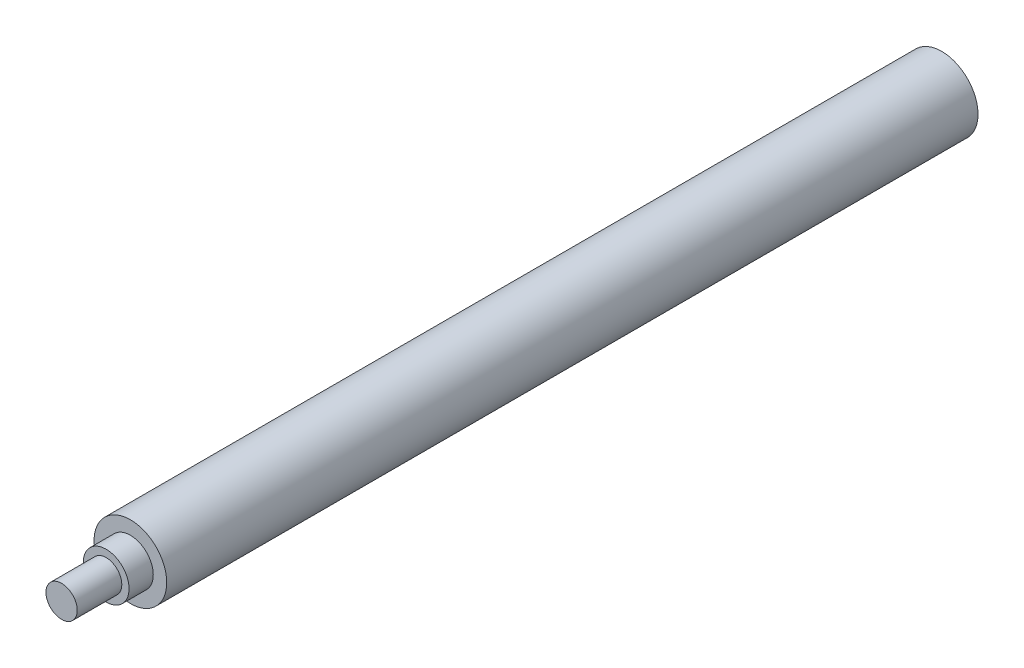
ISO-10303-21;
HEADER;
FILE_DESCRIPTION(('STEP AP214'),'2;1');
FILE_NAME('part.step','',(''),(''),'','','');
FILE_SCHEMA(('AUTOMOTIVE_DESIGN { 1 0 10303 214 1 1 1 1 }'));
ENDSEC;
DATA;
#1=APPLICATION_CONTEXT('core data for automotive mechanical design processes');
#2=APPLICATION_PROTOCOL_DEFINITION('international standard','automotive_design',2000,#1);
#3=PRODUCT_CONTEXT('',#1,'mechanical');
#4=PRODUCT('Part','Part','',(#3));
#5=PRODUCT_RELATED_PRODUCT_CATEGORY('part','',(#4));
#6=PRODUCT_DEFINITION_FORMATION('','',#4);
#7=PRODUCT_DEFINITION_CONTEXT('part definition',#1,'design');
#8=PRODUCT_DEFINITION('design','',#6,#7);
#9=PRODUCT_DEFINITION_SHAPE('','',#8);
#10=(LENGTH_UNIT() NAMED_UNIT(*) SI_UNIT(.MILLI.,.METRE.));
#11=(NAMED_UNIT(*) PLANE_ANGLE_UNIT() SI_UNIT($,.RADIAN.));
#12=(NAMED_UNIT(*) SI_UNIT($,.STERADIAN.) SOLID_ANGLE_UNIT());
#13=UNCERTAINTY_MEASURE_WITH_UNIT(LENGTH_MEASURE(1.E-05),#10,'distance_accuracy_value','');
#14=(GEOMETRIC_REPRESENTATION_CONTEXT(3) GLOBAL_UNCERTAINTY_ASSIGNED_CONTEXT((#13)) GLOBAL_UNIT_ASSIGNED_CONTEXT((#10,
#11,#12)) REPRESENTATION_CONTEXT('',''));
#15=CARTESIAN_POINT('',(0.,0.,0.));
#16=DIRECTION('',(0.,0.,1.));
#17=DIRECTION('',(1.,0.,0.));
#18=AXIS2_PLACEMENT_3D('',#15,#16,#17);
#19=CARTESIAN_POINT('',(0.,0.,10.6045000000001));
#20=DIRECTION('',(0.,0.,1.));
#21=DIRECTION('',(1.,0.,0.));
#22=AXIS2_PLACEMENT_3D('',#19,#20,#21);
#23=CYLINDRICAL_SURFACE('',#22,4.7625);
#24=CARTESIAN_POINT('',(0.,0.,-104.775));
#25=DIRECTION('',(0.,0.,1.));
#26=DIRECTION('',(1.,0.,0.));
#27=AXIS2_PLACEMENT_3D('',#24,#25,#26);
#28=CIRCLE('',#27,4.7625);
#29=CARTESIAN_POINT('',(4.7625,0.,-104.775));
#30=VERTEX_POINT('',#29);
#31=EDGE_CURVE('E12',#30,#30,#28,.T.);
#32=ORIENTED_EDGE('',*,*,#31,.T.);
#33=EDGE_LOOP('',(#32));
#34=FACE_BOUND('',#33,.T.);
#35=CARTESIAN_POINT('',(0.,0.,1.5875));
#36=DIRECTION('',(0.,0.,1.));
#37=DIRECTION('',(1.,0.,0.));
#38=AXIS2_PLACEMENT_3D('',#35,#36,#37);
#39=CIRCLE('',#38,4.7625);
#40=CARTESIAN_POINT('',(4.7625,0.,1.5875));
#41=VERTEX_POINT('',#40);
#42=EDGE_CURVE('E63',#41,#41,#39,.T.);
#43=ORIENTED_EDGE('',*,*,#42,.F.);
#44=EDGE_LOOP('',(#43));
#45=FACE_BOUND('',#44,.T.);
#46=ADVANCED_FACE('F41',(#34,#45),#23,.T.);
#47=CARTESIAN_POINT('',(4.7625,0.,-104.775));
#48=DIRECTION('',(0.,0.,-1.));
#49=DIRECTION('',(-1.,0.,0.));
#50=AXIS2_PLACEMENT_3D('',#47,#48,#49);
#51=PLANE('',#50);
#52=ORIENTED_EDGE('',*,*,#31,.F.);
#53=EDGE_LOOP('',(#52));
#54=FACE_BOUND('',#53,.T.);
#55=ADVANCED_FACE('F71',(#54),#51,.T.);
#56=CARTESIAN_POINT('',(2.05,0.,10.6045000000001));
#57=DIRECTION('',(0.,0.,1.));
#58=DIRECTION('',(1.,0.,0.));
#59=AXIS2_PLACEMENT_3D('',#56,#57,#58);
#60=PLANE('',#59);
#61=CARTESIAN_POINT('',(0.,0.,10.6045000000001));
#62=DIRECTION('',(0.,0.,1.));
#63=DIRECTION('',(1.,0.,0.));
#64=AXIS2_PLACEMENT_3D('',#61,#62,#63);
#65=CIRCLE('',#64,2.05);
#66=CARTESIAN_POINT('',(2.05,0.,10.6045000000001));
#67=VERTEX_POINT('',#66);
#68=EDGE_CURVE('E47',#67,#67,#65,.T.);
#69=ORIENTED_EDGE('',*,*,#68,.T.);
#70=EDGE_LOOP('',(#69));
#71=FACE_BOUND('',#70,.T.);
#72=ADVANCED_FACE('F75',(#71),#60,.T.);
#73=CARTESIAN_POINT('',(0.,0.,10.6045000000001));
#74=DIRECTION('',(0.,0.,1.));
#75=DIRECTION('',(1.,0.,0.));
#76=AXIS2_PLACEMENT_3D('',#73,#74,#75);
#77=CYLINDRICAL_SURFACE('',#76,2.05);
#78=CARTESIAN_POINT('',(0.,0.,4.76250000000011));
#79=DIRECTION('',(0.,0.,1.));
#80=DIRECTION('',(1.,0.,0.));
#81=AXIS2_PLACEMENT_3D('',#78,#79,#80);
#82=CIRCLE('',#81,2.05);
#83=CARTESIAN_POINT('',(2.05,0.,4.76250000000011));
#84=VERTEX_POINT('',#83);
#85=EDGE_CURVE('E51',#84,#84,#82,.T.);
#86=ORIENTED_EDGE('',*,*,#85,.T.);
#87=EDGE_LOOP('',(#86));
#88=FACE_BOUND('',#87,.T.);
#89=ORIENTED_EDGE('',*,*,#68,.F.);
#90=EDGE_LOOP('',(#89));
#91=FACE_BOUND('',#90,.T.);
#92=ADVANCED_FACE('F80',(#88,#91),#77,.T.);
#93=CARTESIAN_POINT('',(3.,0.,4.76250000000006));
#94=DIRECTION('',(0.,0.,1.));
#95=DIRECTION('',(1.,0.,0.));
#96=AXIS2_PLACEMENT_3D('',#93,#94,#95);
#97=PLANE('',#96);
#98=CARTESIAN_POINT('',(0.,0.,4.7625));
#99=DIRECTION('',(0.,0.,1.));
#100=DIRECTION('',(1.,0.,0.));
#101=AXIS2_PLACEMENT_3D('',#98,#99,#100);
#102=CIRCLE('',#101,3.);
#103=CARTESIAN_POINT('',(3.,0.,4.7625));
#104=VERTEX_POINT('',#103);
#105=EDGE_CURVE('E55',#104,#104,#102,.T.);
#106=ORIENTED_EDGE('',*,*,#105,.T.);
#107=EDGE_LOOP('',(#106));
#108=FACE_BOUND('',#107,.T.);
#109=ORIENTED_EDGE('',*,*,#85,.F.);
#110=EDGE_LOOP('',(#109));
#111=FACE_BOUND('',#110,.T.);
#112=ADVANCED_FACE('F85',(#108,#111),#97,.T.);
#113=CARTESIAN_POINT('',(0.,0.,10.6045000000001));
#114=DIRECTION('',(0.,0.,1.));
#115=DIRECTION('',(1.,0.,0.));
#116=AXIS2_PLACEMENT_3D('',#113,#114,#115);
#117=CYLINDRICAL_SURFACE('',#116,3.);
#118=CARTESIAN_POINT('',(0.,0.,1.5875));
#119=DIRECTION('',(0.,0.,1.));
#120=DIRECTION('',(1.,0.,0.));
#121=AXIS2_PLACEMENT_3D('',#118,#119,#120);
#122=CIRCLE('',#121,3.);
#123=CARTESIAN_POINT('',(3.,0.,1.5875));
#124=VERTEX_POINT('',#123);
#125=EDGE_CURVE('E60',#124,#124,#122,.T.);
#126=ORIENTED_EDGE('',*,*,#125,.T.);
#127=EDGE_LOOP('',(#126));
#128=FACE_BOUND('',#127,.T.);
#129=ORIENTED_EDGE('',*,*,#105,.F.);
#130=EDGE_LOOP('',(#129));
#131=FACE_BOUND('',#130,.T.);
#132=ADVANCED_FACE('F89',(#128,#131),#117,.T.);
#133=CARTESIAN_POINT('',(4.7625,0.,1.5875));
#134=DIRECTION('',(0.,0.,1.));
#135=DIRECTION('',(1.,0.,0.));
#136=AXIS2_PLACEMENT_3D('',#133,#134,#135);
#137=PLANE('',#136);
#138=ORIENTED_EDGE('',*,*,#42,.T.);
#139=EDGE_LOOP('',(#138));
#140=FACE_BOUND('',#139,.T.);
#141=ORIENTED_EDGE('',*,*,#125,.F.);
#142=EDGE_LOOP('',(#141));
#143=FACE_BOUND('',#142,.T.);
#144=ADVANCED_FACE('F67',(#140,#143),#137,.T.);
#145=CLOSED_SHELL('',(#46,#55,#72,#92,#112,#132,#144));
#146=MANIFOLD_SOLID_BREP('B2',#145);
#147=ADVANCED_BREP_SHAPE_REPRESENTATION('',(#18,#146),#14);
#148=SHAPE_DEFINITION_REPRESENTATION(#9,#147);
ENDSEC;
END-ISO-10303-21;
